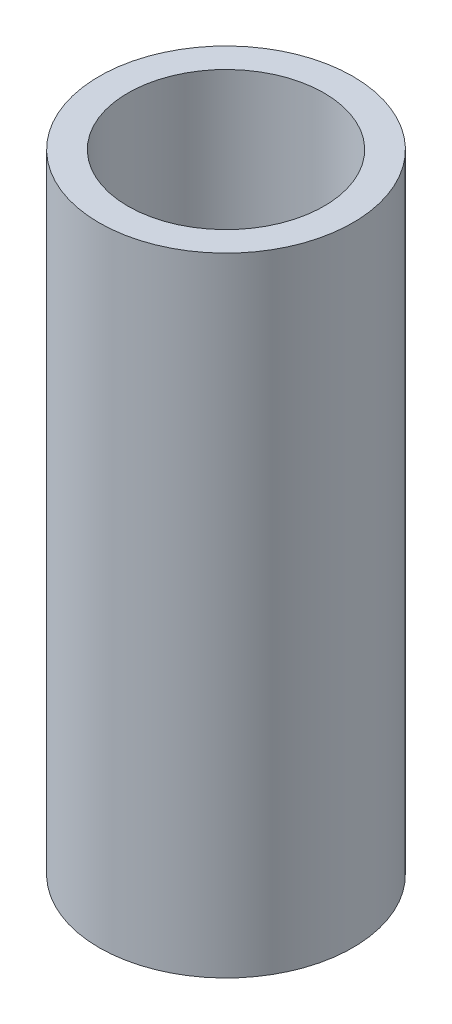
ISO-10303-21;
HEADER;
FILE_DESCRIPTION(('STEP AP214'),'2;1');
FILE_NAME('part.step','',(''),(''),'','','');
FILE_SCHEMA(('AUTOMOTIVE_DESIGN { 1 0 10303 214 1 1 1 1 }'));
ENDSEC;
DATA;
#1=APPLICATION_CONTEXT('core data for automotive mechanical design processes');
#2=APPLICATION_PROTOCOL_DEFINITION('international standard','automotive_design',2000,#1);
#3=PRODUCT_CONTEXT('',#1,'mechanical');
#4=PRODUCT('Part','Part','',(#3));
#5=PRODUCT_RELATED_PRODUCT_CATEGORY('part','',(#4));
#6=PRODUCT_DEFINITION_FORMATION('','',#4);
#7=PRODUCT_DEFINITION_CONTEXT('part definition',#1,'design');
#8=PRODUCT_DEFINITION('design','',#6,#7);
#9=PRODUCT_DEFINITION_SHAPE('','',#8);
#10=(LENGTH_UNIT() NAMED_UNIT(*) SI_UNIT(.MILLI.,.METRE.));
#11=(NAMED_UNIT(*) PLANE_ANGLE_UNIT() SI_UNIT($,.RADIAN.));
#12=(NAMED_UNIT(*) SI_UNIT($,.STERADIAN.) SOLID_ANGLE_UNIT());
#13=UNCERTAINTY_MEASURE_WITH_UNIT(LENGTH_MEASURE(1.E-05),#10,'distance_accuracy_value','');
#14=(GEOMETRIC_REPRESENTATION_CONTEXT(3) GLOBAL_UNCERTAINTY_ASSIGNED_CONTEXT((#13)) GLOBAL_UNIT_ASSIGNED_CONTEXT((#10,
#11,#12)) REPRESENTATION_CONTEXT('',''));
#15=CARTESIAN_POINT('',(0.,0.,0.));
#16=DIRECTION('',(0.,0.,1.));
#17=DIRECTION('',(1.,0.,0.));
#18=AXIS2_PLACEMENT_3D('',#15,#16,#17);
#19=CARTESIAN_POINT('',(0.,10.16,0.));
#20=DIRECTION('',(0.,1.,0.));
#21=DIRECTION('',(0.,0.,1.));
#22=AXIS2_PLACEMENT_3D('',#19,#20,#21);
#23=PLANE('',#22);
#24=CARTESIAN_POINT('',(0.,10.16,0.));
#25=DIRECTION('',(0.,1.,0.));
#26=DIRECTION('',(0.,0.,1.));
#27=AXIS2_PLACEMENT_3D('',#24,#25,#26);
#28=CIRCLE('',#27,2.05337990259794);
#29=CARTESIAN_POINT('',(0.,10.16,2.05337990259794));
#30=VERTEX_POINT('',#29);
#31=EDGE_CURVE('E10',#30,#30,#28,.T.);
#32=ORIENTED_EDGE('',*,*,#31,.T.);
#33=EDGE_LOOP('',(#32));
#34=FACE_BOUND('',#33,.T.);
#35=CARTESIAN_POINT('',(0.,10.16,0.));
#36=DIRECTION('',(0.,1.,0.));
#37=DIRECTION('',(0.,0.,1.));
#38=AXIS2_PLACEMENT_3D('',#35,#36,#37);
#39=CIRCLE('',#38,1.5875);
#40=CARTESIAN_POINT('',(0.,10.16,1.5875));
#41=VERTEX_POINT('',#40);
#42=EDGE_CURVE('E56',#41,#41,#39,.T.);
#43=ORIENTED_EDGE('',*,*,#42,.F.);
#44=EDGE_LOOP('',(#43));
#45=FACE_BOUND('',#44,.T.);
#46=ADVANCED_FACE('F43',(#34,#45),#23,.T.);
#47=CARTESIAN_POINT('',(0.,0.,0.));
#48=DIRECTION('',(0.,1.,0.));
#49=DIRECTION('',(0.,0.,1.));
#50=AXIS2_PLACEMENT_3D('',#47,#48,#49);
#51=PLANE('',#50);
#52=CARTESIAN_POINT('',(0.,0.,0.));
#53=DIRECTION('',(0.,1.,0.));
#54=DIRECTION('',(0.,0.,1.));
#55=AXIS2_PLACEMENT_3D('',#52,#53,#54);
#56=CIRCLE('',#55,2.05337990259794);
#57=CARTESIAN_POINT('',(0.,0.,2.05337990259794));
#58=VERTEX_POINT('',#57);
#59=EDGE_CURVE('E47',#58,#58,#56,.T.);
#60=ORIENTED_EDGE('',*,*,#59,.F.);
#61=EDGE_LOOP('',(#60));
#62=FACE_BOUND('',#61,.T.);
#63=CARTESIAN_POINT('',(0.,0.,0.));
#64=DIRECTION('',(0.,1.,0.));
#65=DIRECTION('',(0.,0.,1.));
#66=AXIS2_PLACEMENT_3D('',#63,#64,#65);
#67=CIRCLE('',#66,1.5875);
#68=CARTESIAN_POINT('',(0.,0.,1.5875));
#69=VERTEX_POINT('',#68);
#70=EDGE_CURVE('E58',#69,#69,#67,.T.);
#71=ORIENTED_EDGE('',*,*,#70,.T.);
#72=EDGE_LOOP('',(#71));
#73=FACE_BOUND('',#72,.T.);
#74=ADVANCED_FACE('F70',(#62,#73),#51,.F.);
#75=CARTESIAN_POINT('',(0.,10.16,0.));
#76=DIRECTION('',(0.,-1.,0.));
#77=DIRECTION('',(0.,0.,-1.));
#78=AXIS2_PLACEMENT_3D('',#75,#76,#77);
#79=CYLINDRICAL_SURFACE('',#78,2.05337990259794);
#80=ORIENTED_EDGE('',*,*,#31,.F.);
#81=EDGE_LOOP('',(#80));
#82=FACE_BOUND('',#81,.T.);
#83=ORIENTED_EDGE('',*,*,#59,.T.);
#84=EDGE_LOOP('',(#83));
#85=FACE_BOUND('',#84,.T.);
#86=ADVANCED_FACE('F45',(#82,#85),#79,.T.);
#87=CARTESIAN_POINT('',(0.,10.16,0.));
#88=DIRECTION('',(0.,-1.,0.));
#89=DIRECTION('',(0.,0.,-1.));
#90=AXIS2_PLACEMENT_3D('',#87,#88,#89);
#91=CYLINDRICAL_SURFACE('',#90,1.5875);
#92=ORIENTED_EDGE('',*,*,#42,.T.);
#93=EDGE_LOOP('',(#92));
#94=FACE_BOUND('',#93,.T.);
#95=ORIENTED_EDGE('',*,*,#70,.F.);
#96=EDGE_LOOP('',(#95));
#97=FACE_BOUND('',#96,.T.);
#98=ADVANCED_FACE('F66',(#94,#97),#91,.F.);
#99=CLOSED_SHELL('',(#46,#74,#86,#98));
#100=MANIFOLD_SOLID_BREP('B2',#99);
#101=ADVANCED_BREP_SHAPE_REPRESENTATION('',(#18,#100),#14);
#102=SHAPE_DEFINITION_REPRESENTATION(#9,#101);
ENDSEC;
END-ISO-10303-21;
